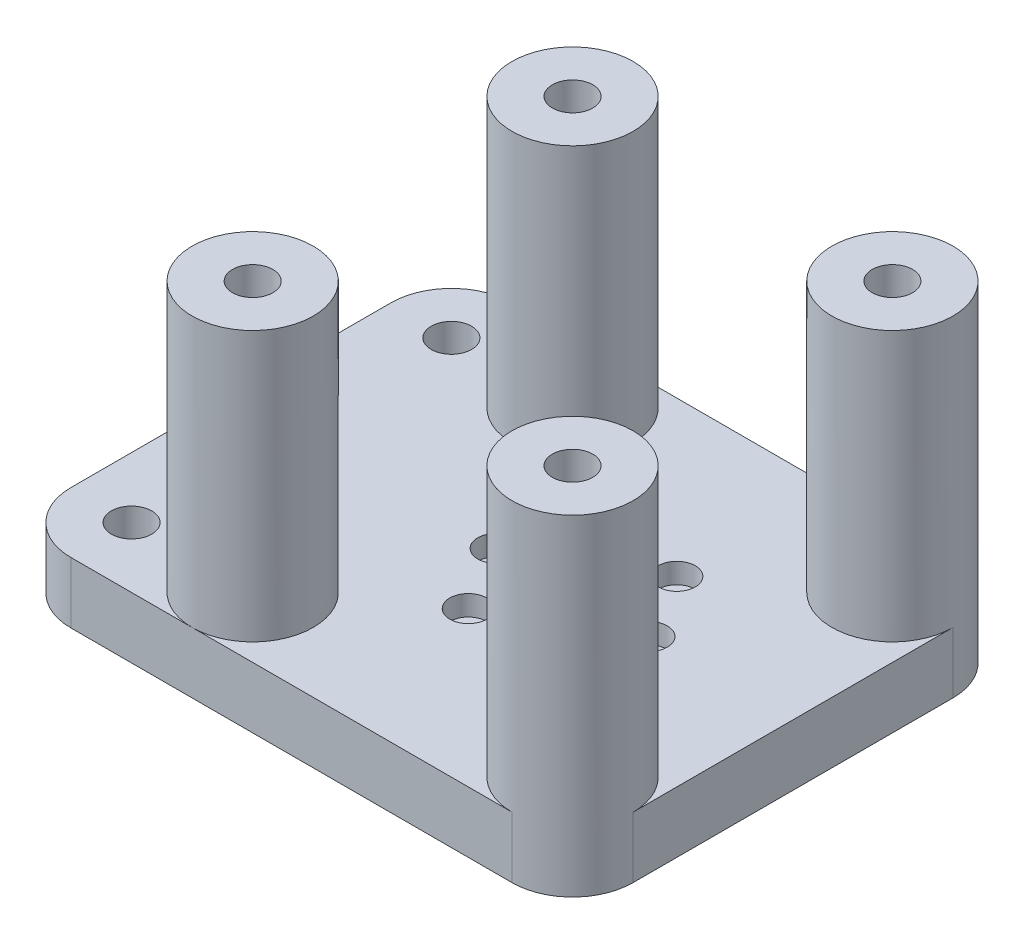
ISO-10303-21;
HEADER;
FILE_DESCRIPTION(('STEP AP214'),'2;1');
FILE_NAME('part.step','',(''),(''),'','','');
FILE_SCHEMA(('AUTOMOTIVE_DESIGN { 1 0 10303 214 1 1 1 1 }'));
ENDSEC;
DATA;
#1=APPLICATION_CONTEXT('core data for automotive mechanical design processes');
#2=APPLICATION_PROTOCOL_DEFINITION('international standard','automotive_design',2000,#1);
#3=PRODUCT_CONTEXT('',#1,'mechanical');
#4=PRODUCT('Part','Part','',(#3));
#5=PRODUCT_RELATED_PRODUCT_CATEGORY('part','',(#4));
#6=PRODUCT_DEFINITION_FORMATION('','',#4);
#7=PRODUCT_DEFINITION_CONTEXT('part definition',#1,'design');
#8=PRODUCT_DEFINITION('design','',#6,#7);
#9=PRODUCT_DEFINITION_SHAPE('','',#8);
#10=(LENGTH_UNIT() NAMED_UNIT(*) SI_UNIT(.MILLI.,.METRE.));
#11=(NAMED_UNIT(*) PLANE_ANGLE_UNIT() SI_UNIT($,.RADIAN.));
#12=(NAMED_UNIT(*) SI_UNIT($,.STERADIAN.) SOLID_ANGLE_UNIT());
#13=UNCERTAINTY_MEASURE_WITH_UNIT(LENGTH_MEASURE(1.E-05),#10,'distance_accuracy_value','');
#14=(GEOMETRIC_REPRESENTATION_CONTEXT(3) GLOBAL_UNCERTAINTY_ASSIGNED_CONTEXT((#13)) GLOBAL_UNIT_ASSIGNED_CONTEXT((#10,
#11,#12)) REPRESENTATION_CONTEXT('',''));
#15=CARTESIAN_POINT('',(0.,0.,0.));
#16=DIRECTION('',(0.,0.,1.));
#17=DIRECTION('',(1.,0.,0.));
#18=AXIS2_PLACEMENT_3D('',#15,#16,#17);
#19=CARTESIAN_POINT('',(31.430896423742,12.,-31.430896423742));
#20=DIRECTION('',(0.,1.,0.));
#21=DIRECTION('',(0.,0.,1.));
#22=AXIS2_PLACEMENT_3D('',#19,#20,#21);
#23=PLANE('',#22);
#24=CARTESIAN_POINT('',(-55.243396423742,12.,31.430896423742));
#25=DIRECTION('',(0.,1.,0.));
#26=DIRECTION('',(0.,0.,1.));
#27=AXIS2_PLACEMENT_3D('',#24,#25,#26);
#28=CIRCLE('',#27,3.96875);
#29=CARTESIAN_POINT('',(-55.243396423742,12.,35.399646423742));
#30=VERTEX_POINT('',#29);
#31=EDGE_CURVE('E221',#30,#30,#28,.T.);
#32=ORIENTED_EDGE('',*,*,#31,.F.);
#33=EDGE_LOOP('',(#32));
#34=FACE_BOUND('',#33,.T.);
#35=CARTESIAN_POINT('',(0.,12.,0.));
#36=DIRECTION('',(0.,1.,0.));
#37=DIRECTION('',(0.,0.,1.));
#38=AXIS2_PLACEMENT_3D('',#35,#36,#37);
#39=CIRCLE('',#38,10.5);
#40=CARTESIAN_POINT('',(0.,12.,10.5));
#41=VERTEX_POINT('',#40);
#42=EDGE_CURVE('E260',#41,#41,#39,.T.);
#43=ORIENTED_EDGE('',*,*,#42,.F.);
#44=EDGE_LOOP('',(#43));
#45=FACE_BOUND('',#44,.T.);
#46=CARTESIAN_POINT('',(-55.243396423742,12.,-31.430896423742));
#47=DIRECTION('',(0.,1.,0.));
#48=DIRECTION('',(0.,0.,1.));
#49=AXIS2_PLACEMENT_3D('',#46,#47,#48);
#50=CIRCLE('',#49,3.96875);
#51=CARTESIAN_POINT('',(-55.243396423742,12.,-27.462146423742));
#52=VERTEX_POINT('',#51);
#53=EDGE_CURVE('E227',#52,#52,#50,.T.);
#54=ORIENTED_EDGE('',*,*,#53,.F.);
#55=EDGE_LOOP('',(#54));
#56=FACE_BOUND('',#55,.T.);
#57=CARTESIAN_POINT('',(-7.5,12.,-12.9903810567666));
#58=DIRECTION('',(0.,1.,0.));
#59=DIRECTION('',(0.,0.,1.));
#60=AXIS2_PLACEMENT_3D('',#57,#58,#59);
#61=CIRCLE('',#60,3.62500000000001);
#62=CARTESIAN_POINT('',(-7.5,12.,-9.36538105676656));
#63=VERTEX_POINT('',#62);
#64=EDGE_CURVE('E177',#63,#63,#61,.T.);
#65=ORIENTED_EDGE('',*,*,#64,.F.);
#66=EDGE_LOOP('',(#65));
#67=FACE_BOUND('',#66,.T.);
#68=CARTESIAN_POINT('',(7.50000000000001,12.,-12.9903810567666));
#69=DIRECTION('',(0.,1.,0.));
#70=DIRECTION('',(0.,0.,1.));
#71=AXIS2_PLACEMENT_3D('',#68,#69,#70);
#72=CIRCLE('',#71,3.625);
#73=CARTESIAN_POINT('',(7.50000000000001,12.,-9.36538105676657));
#74=VERTEX_POINT('',#73);
#75=EDGE_CURVE('E182',#74,#74,#72,.T.);
#76=ORIENTED_EDGE('',*,*,#75,.F.);
#77=EDGE_LOOP('',(#76));
#78=FACE_BOUND('',#77,.T.);
#79=CARTESIAN_POINT('',(15.,12.,0.));
#80=DIRECTION('',(0.,1.,0.));
#81=DIRECTION('',(0.,0.,1.));
#82=AXIS2_PLACEMENT_3D('',#79,#80,#81);
#83=CIRCLE('',#82,3.625);
#84=CARTESIAN_POINT('',(15.,12.,3.62500000000003));
#85=VERTEX_POINT('',#84);
#86=EDGE_CURVE('E186',#85,#85,#83,.T.);
#87=ORIENTED_EDGE('',*,*,#86,.F.);
#88=EDGE_LOOP('',(#87));
#89=FACE_BOUND('',#88,.T.);
#90=CARTESIAN_POINT('',(7.49999999999998,12.,12.9903810567666));
#91=DIRECTION('',(0.,1.,0.));
#92=DIRECTION('',(0.,0.,1.));
#93=AXIS2_PLACEMENT_3D('',#90,#91,#92);
#94=CIRCLE('',#93,3.625);
#95=CARTESIAN_POINT('',(7.49999999999998,12.,16.6153810567666));
#96=VERTEX_POINT('',#95);
#97=EDGE_CURVE('E190',#96,#96,#94,.T.);
#98=ORIENTED_EDGE('',*,*,#97,.F.);
#99=EDGE_LOOP('',(#98));
#100=FACE_BOUND('',#99,.T.);
#101=CARTESIAN_POINT('',(-7.50000000000002,12.,12.9903810567666));
#102=DIRECTION('',(0.,1.,0.));
#103=DIRECTION('',(0.,0.,1.));
#104=AXIS2_PLACEMENT_3D('',#101,#102,#103);
#105=CIRCLE('',#104,3.62499999999999);
#106=CARTESIAN_POINT('',(-7.50000000000002,12.,16.6153810567666));
#107=VERTEX_POINT('',#106);
#108=EDGE_CURVE('E197',#107,#107,#105,.T.);
#109=ORIENTED_EDGE('',*,*,#108,.F.);
#110=EDGE_LOOP('',(#109));
#111=FACE_BOUND('',#110,.T.);
#112=CARTESIAN_POINT('',(-15.,12.,0.));
#113=DIRECTION('',(0.,1.,0.));
#114=DIRECTION('',(0.,0.,1.));
#115=AXIS2_PLACEMENT_3D('',#112,#113,#114);
#116=CIRCLE('',#115,3.625);
#117=CARTESIAN_POINT('',(-15.,12.,3.62500000000001));
#118=VERTEX_POINT('',#117);
#119=EDGE_CURVE('E204',#118,#118,#116,.T.);
#120=ORIENTED_EDGE('',*,*,#119,.F.);
#121=EDGE_LOOP('',(#120));
#122=FACE_BOUND('',#121,.T.);
#123=DIRECTION('',(1.,0.,0.));
#124=VECTOR('',#123,1.);
#125=CARTESIAN_POINT('',(-55.243396423742,12.,43.337146423742));
#126=LINE('',#125,#124);
#127=CARTESIAN_POINT('',(-55.243396423742,12.,43.337146423742));
#128=VERTEX_POINT('',#127);
#129=CARTESIAN_POINT('',(-31.430896423742,12.,43.337146423742));
#130=VERTEX_POINT('',#129);
#131=EDGE_CURVE('E116',#128,#130,#126,.T.);
#132=ORIENTED_EDGE('',*,*,#131,.T.);
#133=CARTESIAN_POINT('',(-31.430896423742,12.,31.430896423742));
#134=DIRECTION('',(0.,1.,0.));
#135=DIRECTION('',(0.,0.,1.));
#136=AXIS2_PLACEMENT_3D('',#133,#134,#135);
#137=CIRCLE('',#136,11.90625);
#138=EDGE_CURVE('E52',#130,#130,#137,.T.);
#139=ORIENTED_EDGE('',*,*,#138,.F.);
#140=CARTESIAN_POINT('',(31.430896423742,12.,43.337146423742));
#141=VERTEX_POINT('',#140);
#142=EDGE_CURVE('E122',#130,#141,#126,.T.);
#143=ORIENTED_EDGE('',*,*,#142,.T.);
#144=CARTESIAN_POINT('',(31.430896423742,12.,31.430896423742));
#145=DIRECTION('',(0.,1.,0.));
#146=DIRECTION('',(0.,0.,1.));
#147=AXIS2_PLACEMENT_3D('',#144,#145,#146);
#148=CIRCLE('',#147,11.90625);
#149=CARTESIAN_POINT('',(43.337146423742,12.,31.430896423742));
#150=VERTEX_POINT('',#149);
#151=EDGE_CURVE('E289',#150,#141,#148,.T.);
#152=ORIENTED_EDGE('',*,*,#151,.F.);
#153=DIRECTION('',(0.,0.,-1.));
#154=VECTOR('',#153,1.);
#155=CARTESIAN_POINT('',(43.337146423742,12.,-31.430896423742));
#156=LINE('',#155,#154);
#157=CARTESIAN_POINT('',(43.337146423742,12.,-31.430896423742));
#158=VERTEX_POINT('',#157);
#159=EDGE_CURVE('E60',#150,#158,#156,.T.);
#160=ORIENTED_EDGE('',*,*,#159,.T.);
#161=CARTESIAN_POINT('',(31.430896423742,12.,-31.4308964237421));
#162=DIRECTION('',(0.,1.,0.));
#163=DIRECTION('',(0.,0.,1.));
#164=AXIS2_PLACEMENT_3D('',#161,#162,#163);
#165=CIRCLE('',#164,11.90625);
#166=CARTESIAN_POINT('',(31.430896423742,12.,-43.337146423742));
#167=VERTEX_POINT('',#166);
#168=EDGE_CURVE('E303',#167,#158,#165,.T.);
#169=ORIENTED_EDGE('',*,*,#168,.F.);
#170=DIRECTION('',(-1.,0.,0.));
#171=VECTOR('',#170,1.);
#172=CARTESIAN_POINT('',(-55.243396423742,12.,-43.337146423742));
#173=LINE('',#172,#171);
#174=CARTESIAN_POINT('',(-31.430896423742,12.,-43.337146423742));
#175=VERTEX_POINT('',#174);
#176=EDGE_CURVE('E267',#167,#175,#173,.T.);
#177=ORIENTED_EDGE('',*,*,#176,.T.);
#178=CARTESIAN_POINT('',(-31.430896423742,12.,-31.430896423742));
#179=DIRECTION('',(0.,1.,0.));
#180=DIRECTION('',(0.,0.,1.));
#181=AXIS2_PLACEMENT_3D('',#178,#179,#180);
#182=CIRCLE('',#181,11.90625);
#183=EDGE_CURVE('E312',#175,#175,#182,.T.);
#184=ORIENTED_EDGE('',*,*,#183,.F.);
#185=CARTESIAN_POINT('',(-55.243396423742,12.,-43.337146423742));
#186=VERTEX_POINT('',#185);
#187=EDGE_CURVE('E102',#175,#186,#173,.T.);
#188=ORIENTED_EDGE('',*,*,#187,.T.);
#189=CARTESIAN_POINT('',(-55.243396423742,12.,-31.430896423742));
#190=DIRECTION('',(0.,1.,0.));
#191=DIRECTION('',(0.,0.,1.));
#192=AXIS2_PLACEMENT_3D('',#189,#190,#191);
#193=CIRCLE('',#192,11.90625);
#194=CARTESIAN_POINT('',(-67.149646423742,12.,-31.430896423742));
#195=VERTEX_POINT('',#194);
#196=EDGE_CURVE('E270',#186,#195,#193,.T.);
#197=ORIENTED_EDGE('',*,*,#196,.T.);
#198=DIRECTION('',(0.,0.,1.));
#199=VECTOR('',#198,1.);
#200=CARTESIAN_POINT('',(-67.149646423742,12.,-31.430896423742));
#201=LINE('',#200,#199);
#202=CARTESIAN_POINT('',(-67.149646423742,12.,31.430896423742));
#203=VERTEX_POINT('',#202);
#204=EDGE_CURVE('E118',#195,#203,#201,.T.);
#205=ORIENTED_EDGE('',*,*,#204,.T.);
#206=CARTESIAN_POINT('',(-55.243396423742,12.,31.430896423742));
#207=DIRECTION('',(0.,1.,0.));
#208=DIRECTION('',(0.,0.,1.));
#209=AXIS2_PLACEMENT_3D('',#206,#207,#208);
#210=CIRCLE('',#209,11.90625);
#211=EDGE_CURVE('E113',#203,#128,#210,.T.);
#212=ORIENTED_EDGE('',*,*,#211,.T.);
#213=EDGE_LOOP('',(#132,#139,#143,#152,#160,#169,#177,#184,#188,#197,#205,#212));
#214=FACE_BOUND('',#213,.T.);
#215=ADVANCED_FACE('F37',(#34,#45,#56,#67,#78,#89,#100,#111,#122,#214),#23,.T.);
#216=CARTESIAN_POINT('',(-15.,12.,0.));
#217=DIRECTION('',(0.,-1.,0.));
#218=DIRECTION('',(0.,0.,-1.));
#219=AXIS2_PLACEMENT_3D('',#216,#217,#218);
#220=CYLINDRICAL_SURFACE('',#219,2.);
#221=CARTESIAN_POINT('',(-15.,0.,0.));
#222=DIRECTION('',(0.,1.,0.));
#223=DIRECTION('',(0.,0.,1.));
#224=AXIS2_PLACEMENT_3D('',#221,#222,#223);
#225=CIRCLE('',#224,2.);
#226=CARTESIAN_POINT('',(-15.,0.,2.00000000000001));
#227=VERTEX_POINT('',#226);
#228=EDGE_CURVE('E230',#227,#227,#225,.T.);
#229=ORIENTED_EDGE('',*,*,#228,.F.);
#230=EDGE_LOOP('',(#229));
#231=FACE_BOUND('',#230,.T.);
#232=CARTESIAN_POINT('',(-15.,8.,0.));
#233=DIRECTION('',(0.,1.,0.));
#234=DIRECTION('',(0.,0.,1.));
#235=AXIS2_PLACEMENT_3D('',#232,#233,#234);
#236=CIRCLE('',#235,2.);
#237=CARTESIAN_POINT('',(-15.,8.,2.00000000000001));
#238=VERTEX_POINT('',#237);
#239=EDGE_CURVE('E41',#238,#238,#236,.T.);
#240=ORIENTED_EDGE('',*,*,#239,.T.);
#241=EDGE_LOOP('',(#240));
#242=FACE_BOUND('',#241,.T.);
#243=ADVANCED_FACE('F330',(#231,#242),#220,.F.);
#244=CARTESIAN_POINT('',(-7.49999999999999,12.,12.9903810567666));
#245=DIRECTION('',(0.,-1.,0.));
#246=DIRECTION('',(0.,0.,-1.));
#247=AXIS2_PLACEMENT_3D('',#244,#245,#246);
#248=CYLINDRICAL_SURFACE('',#247,2.);
#249=CARTESIAN_POINT('',(-7.49999999999999,0.,12.9903810567666));
#250=DIRECTION('',(0.,1.,0.));
#251=DIRECTION('',(0.,0.,1.));
#252=AXIS2_PLACEMENT_3D('',#249,#250,#251);
#253=CIRCLE('',#252,2.);
#254=CARTESIAN_POINT('',(-7.49999999999999,0.,14.9903810567666));
#255=VERTEX_POINT('',#254);
#256=EDGE_CURVE('E235',#255,#255,#253,.T.);
#257=ORIENTED_EDGE('',*,*,#256,.F.);
#258=EDGE_LOOP('',(#257));
#259=FACE_BOUND('',#258,.T.);
#260=CARTESIAN_POINT('',(-7.49999999999999,8.,12.9903810567666));
#261=DIRECTION('',(0.,1.,0.));
#262=DIRECTION('',(0.,0.,1.));
#263=AXIS2_PLACEMENT_3D('',#260,#261,#262);
#264=CIRCLE('',#263,2.);
#265=CARTESIAN_POINT('',(-7.49999999999999,8.,14.9903810567666));
#266=VERTEX_POINT('',#265);
#267=EDGE_CURVE('E188',#266,#266,#264,.T.);
#268=ORIENTED_EDGE('',*,*,#267,.T.);
#269=EDGE_LOOP('',(#268));
#270=FACE_BOUND('',#269,.T.);
#271=ADVANCED_FACE('F336',(#259,#270),#248,.F.);
#272=CARTESIAN_POINT('',(7.5,12.,12.9903810567666));
#273=DIRECTION('',(0.,-1.,0.));
#274=DIRECTION('',(0.,0.,-1.));
#275=AXIS2_PLACEMENT_3D('',#272,#273,#274);
#276=CYLINDRICAL_SURFACE('',#275,2.);
#277=CARTESIAN_POINT('',(7.5,0.,12.9903810567666));
#278=DIRECTION('',(0.,1.,0.));
#279=DIRECTION('',(0.,0.,1.));
#280=AXIS2_PLACEMENT_3D('',#277,#278,#279);
#281=CIRCLE('',#280,2.);
#282=CARTESIAN_POINT('',(7.5,0.,14.9903810567666));
#283=VERTEX_POINT('',#282);
#284=EDGE_CURVE('E238',#283,#283,#281,.T.);
#285=ORIENTED_EDGE('',*,*,#284,.F.);
#286=EDGE_LOOP('',(#285));
#287=FACE_BOUND('',#286,.T.);
#288=CARTESIAN_POINT('',(7.5,8.,12.9903810567666));
#289=DIRECTION('',(0.,1.,0.));
#290=DIRECTION('',(0.,0.,1.));
#291=AXIS2_PLACEMENT_3D('',#288,#289,#290);
#292=CIRCLE('',#291,2.);
#293=CARTESIAN_POINT('',(7.5,8.,14.9903810567666));
#294=VERTEX_POINT('',#293);
#295=EDGE_CURVE('E184',#294,#294,#292,.T.);
#296=ORIENTED_EDGE('',*,*,#295,.T.);
#297=EDGE_LOOP('',(#296));
#298=FACE_BOUND('',#297,.T.);
#299=ADVANCED_FACE('F445',(#287,#298),#276,.F.);
#300=CARTESIAN_POINT('',(15.,12.,0.));
#301=DIRECTION('',(0.,-1.,0.));
#302=DIRECTION('',(0.,0.,-1.));
#303=AXIS2_PLACEMENT_3D('',#300,#301,#302);
#304=CYLINDRICAL_SURFACE('',#303,2.);
#305=CARTESIAN_POINT('',(15.,0.,0.));
#306=DIRECTION('',(0.,1.,0.));
#307=DIRECTION('',(0.,0.,1.));
#308=AXIS2_PLACEMENT_3D('',#305,#306,#307);
#309=CIRCLE('',#308,2.);
#310=CARTESIAN_POINT('',(15.,0.,2.));
#311=VERTEX_POINT('',#310);
#312=EDGE_CURVE('E241',#311,#311,#309,.T.);
#313=ORIENTED_EDGE('',*,*,#312,.F.);
#314=EDGE_LOOP('',(#313));
#315=FACE_BOUND('',#314,.T.);
#316=CARTESIAN_POINT('',(15.,8.,0.));
#317=DIRECTION('',(0.,1.,0.));
#318=DIRECTION('',(0.,0.,1.));
#319=AXIS2_PLACEMENT_3D('',#316,#317,#318);
#320=CIRCLE('',#319,2.);
#321=CARTESIAN_POINT('',(15.,8.,2.));
#322=VERTEX_POINT('',#321);
#323=EDGE_CURVE('E179',#322,#322,#320,.T.);
#324=ORIENTED_EDGE('',*,*,#323,.T.);
#325=EDGE_LOOP('',(#324));
#326=FACE_BOUND('',#325,.T.);
#327=ADVANCED_FACE('F449',(#315,#326),#304,.F.);
#328=CARTESIAN_POINT('',(7.5,12.,-12.9903810567666));
#329=DIRECTION('',(0.,-1.,0.));
#330=DIRECTION('',(0.,0.,-1.));
#331=AXIS2_PLACEMENT_3D('',#328,#329,#330);
#332=CYLINDRICAL_SURFACE('',#331,2.);
#333=CARTESIAN_POINT('',(7.5,0.,-12.9903810567666));
#334=DIRECTION('',(0.,1.,0.));
#335=DIRECTION('',(0.,0.,1.));
#336=AXIS2_PLACEMENT_3D('',#333,#334,#335);
#337=CIRCLE('',#336,2.);
#338=CARTESIAN_POINT('',(7.5,0.,-10.9903810567666));
#339=VERTEX_POINT('',#338);
#340=EDGE_CURVE('E244',#339,#339,#337,.T.);
#341=ORIENTED_EDGE('',*,*,#340,.F.);
#342=EDGE_LOOP('',(#341));
#343=FACE_BOUND('',#342,.T.);
#344=CARTESIAN_POINT('',(7.5,8.,-12.9903810567666));
#345=DIRECTION('',(0.,1.,0.));
#346=DIRECTION('',(0.,0.,1.));
#347=AXIS2_PLACEMENT_3D('',#344,#345,#346);
#348=CIRCLE('',#347,2.);
#349=CARTESIAN_POINT('',(7.5,8.,-10.9903810567666));
#350=VERTEX_POINT('',#349);
#351=EDGE_CURVE('E174',#350,#350,#348,.T.);
#352=ORIENTED_EDGE('',*,*,#351,.T.);
#353=EDGE_LOOP('',(#352));
#354=FACE_BOUND('',#353,.T.);
#355=ADVANCED_FACE('F453',(#343,#354),#332,.F.);
#356=CARTESIAN_POINT('',(-7.5,12.,-12.9903810567666));
#357=DIRECTION('',(0.,-1.,0.));
#358=DIRECTION('',(0.,0.,-1.));
#359=AXIS2_PLACEMENT_3D('',#356,#357,#358);
#360=CYLINDRICAL_SURFACE('',#359,2.);
#361=CARTESIAN_POINT('',(-7.5,0.,-12.9903810567666));
#362=DIRECTION('',(0.,1.,0.));
#363=DIRECTION('',(0.,0.,1.));
#364=AXIS2_PLACEMENT_3D('',#361,#362,#363);
#365=CIRCLE('',#364,2.);
#366=CARTESIAN_POINT('',(-7.5,0.,-10.9903810567666));
#367=VERTEX_POINT('',#366);
#368=EDGE_CURVE('E247',#367,#367,#365,.T.);
#369=ORIENTED_EDGE('',*,*,#368,.F.);
#370=EDGE_LOOP('',(#369));
#371=FACE_BOUND('',#370,.T.);
#372=CARTESIAN_POINT('',(-7.5,8.,-12.9903810567666));
#373=DIRECTION('',(0.,1.,0.));
#374=DIRECTION('',(0.,0.,1.));
#375=AXIS2_PLACEMENT_3D('',#372,#373,#374);
#376=CIRCLE('',#375,2.);
#377=CARTESIAN_POINT('',(-7.5,8.,-10.9903810567666));
#378=VERTEX_POINT('',#377);
#379=EDGE_CURVE('E169',#378,#378,#376,.T.);
#380=ORIENTED_EDGE('',*,*,#379,.T.);
#381=EDGE_LOOP('',(#380));
#382=FACE_BOUND('',#381,.T.);
#383=ADVANCED_FACE('F347',(#371,#382),#360,.F.);
#384=CARTESIAN_POINT('',(31.430896423742,0.,-31.430896423742));
#385=DIRECTION('',(0.,1.,0.));
#386=DIRECTION('',(0.,0.,1.));
#387=AXIS2_PLACEMENT_3D('',#384,#385,#386);
#388=PLANE('',#387);
#389=CARTESIAN_POINT('',(31.430896423742,0.,-31.430896423742));
#390=DIRECTION('',(0.,1.,0.));
#391=DIRECTION('',(0.,0.,1.));
#392=AXIS2_PLACEMENT_3D('',#389,#390,#391);
#393=CIRCLE('',#392,11.90625);
#394=CARTESIAN_POINT('',(43.337146423742,0.,-31.430896423742));
#395=VERTEX_POINT('',#394);
#396=CARTESIAN_POINT('',(31.430896423742,0.,-43.337146423742));
#397=VERTEX_POINT('',#396);
#398=EDGE_CURVE('E142',#395,#397,#393,.T.);
#399=ORIENTED_EDGE('',*,*,#398,.F.);
#400=DIRECTION('',(0.,0.,-1.));
#401=VECTOR('',#400,1.);
#402=CARTESIAN_POINT('',(43.337146423742,0.,-31.430896423742));
#403=LINE('',#402,#401);
#404=CARTESIAN_POINT('',(43.337146423742,0.,31.430896423742));
#405=VERTEX_POINT('',#404);
#406=EDGE_CURVE('E94',#405,#395,#403,.T.);
#407=ORIENTED_EDGE('',*,*,#406,.F.);
#408=CARTESIAN_POINT('',(31.430896423742,0.,31.430896423742));
#409=DIRECTION('',(0.,1.,0.));
#410=DIRECTION('',(0.,0.,1.));
#411=AXIS2_PLACEMENT_3D('',#408,#409,#410);
#412=CIRCLE('',#411,11.90625);
#413=CARTESIAN_POINT('',(31.430896423742,0.,43.337146423742));
#414=VERTEX_POINT('',#413);
#415=EDGE_CURVE('E155',#414,#405,#412,.T.);
#416=ORIENTED_EDGE('',*,*,#415,.F.);
#417=DIRECTION('',(1.,0.,0.));
#418=VECTOR('',#417,1.);
#419=CARTESIAN_POINT('',(-55.243396423742,0.,43.337146423742));
#420=LINE('',#419,#418);
#421=CARTESIAN_POINT('',(-55.243396423742,0.,43.337146423742));
#422=VERTEX_POINT('',#421);
#423=EDGE_CURVE('E153',#422,#414,#420,.T.);
#424=ORIENTED_EDGE('',*,*,#423,.F.);
#425=CARTESIAN_POINT('',(-55.243396423742,0.,31.430896423742));
#426=DIRECTION('',(0.,1.,0.));
#427=DIRECTION('',(0.,0.,1.));
#428=AXIS2_PLACEMENT_3D('',#425,#426,#427);
#429=CIRCLE('',#428,11.90625);
#430=CARTESIAN_POINT('',(-67.149646423742,0.,31.430896423742));
#431=VERTEX_POINT('',#430);
#432=EDGE_CURVE('E128',#431,#422,#429,.T.);
#433=ORIENTED_EDGE('',*,*,#432,.F.);
#434=DIRECTION('',(0.,0.,1.));
#435=VECTOR('',#434,1.);
#436=CARTESIAN_POINT('',(-67.149646423742,0.,-31.430896423742));
#437=LINE('',#436,#435);
#438=CARTESIAN_POINT('',(-67.149646423742,0.,-31.430896423742));
#439=VERTEX_POINT('',#438);
#440=EDGE_CURVE('E150',#439,#431,#437,.T.);
#441=ORIENTED_EDGE('',*,*,#440,.F.);
#442=CARTESIAN_POINT('',(-55.243396423742,0.,-31.430896423742));
#443=DIRECTION('',(0.,1.,0.));
#444=DIRECTION('',(0.,0.,1.));
#445=AXIS2_PLACEMENT_3D('',#442,#443,#444);
#446=CIRCLE('',#445,11.90625);
#447=CARTESIAN_POINT('',(-55.243396423742,0.,-43.337146423742));
#448=VERTEX_POINT('',#447);
#449=EDGE_CURVE('E148',#448,#439,#446,.T.);
#450=ORIENTED_EDGE('',*,*,#449,.F.);
#451=DIRECTION('',(-1.,0.,0.));
#452=VECTOR('',#451,1.);
#453=CARTESIAN_POINT('',(-55.243396423742,0.,-43.337146423742));
#454=LINE('',#453,#452);
#455=EDGE_CURVE('E145',#397,#448,#454,.T.);
#456=ORIENTED_EDGE('',*,*,#455,.F.);
#457=EDGE_LOOP('',(#399,#407,#416,#424,#433,#441,#450,#456));
#458=FACE_BOUND('',#457,.T.);
#459=CARTESIAN_POINT('',(-31.430896423742,0.,-31.430896423742));
#460=DIRECTION('',(0.,1.,0.));
#461=DIRECTION('',(0.,0.,1.));
#462=AXIS2_PLACEMENT_3D('',#459,#460,#461);
#463=CIRCLE('',#462,3.96875);
#464=CARTESIAN_POINT('',(-31.430896423742,0.,-27.462146423742));
#465=VERTEX_POINT('',#464);
#466=EDGE_CURVE('E146',#465,#465,#463,.T.);
#467=ORIENTED_EDGE('',*,*,#466,.T.);
#468=EDGE_LOOP('',(#467));
#469=FACE_BOUND('',#468,.T.);
#470=CARTESIAN_POINT('',(0.,0.,0.));
#471=DIRECTION('',(0.,1.,0.));
#472=DIRECTION('',(0.,0.,1.));
#473=AXIS2_PLACEMENT_3D('',#470,#471,#472);
#474=CIRCLE('',#473,10.5);
#475=CARTESIAN_POINT('',(0.,0.,10.5));
#476=VERTEX_POINT('',#475);
#477=EDGE_CURVE('E259',#476,#476,#474,.T.);
#478=ORIENTED_EDGE('',*,*,#477,.T.);
#479=EDGE_LOOP('',(#478));
#480=FACE_BOUND('',#479,.T.);
#481=CARTESIAN_POINT('',(31.430896423742,0.,-31.430896423742));
#482=DIRECTION('',(0.,1.,0.));
#483=DIRECTION('',(0.,0.,1.));
#484=AXIS2_PLACEMENT_3D('',#481,#482,#483);
#485=CIRCLE('',#484,3.96875);
#486=CARTESIAN_POINT('',(31.430896423742,0.,-27.462146423742));
#487=VERTEX_POINT('',#486);
#488=EDGE_CURVE('E256',#487,#487,#485,.T.);
#489=ORIENTED_EDGE('',*,*,#488,.T.);
#490=EDGE_LOOP('',(#489));
#491=FACE_BOUND('',#490,.T.);
#492=CARTESIAN_POINT('',(31.430896423742,0.,31.430896423742));
#493=DIRECTION('',(0.,1.,0.));
#494=DIRECTION('',(0.,0.,1.));
#495=AXIS2_PLACEMENT_3D('',#492,#493,#494);
#496=CIRCLE('',#495,3.96875);
#497=CARTESIAN_POINT('',(31.430896423742,0.,35.399646423742));
#498=VERTEX_POINT('',#497);
#499=EDGE_CURVE('E253',#498,#498,#496,.T.);
#500=ORIENTED_EDGE('',*,*,#499,.T.);
#501=EDGE_LOOP('',(#500));
#502=FACE_BOUND('',#501,.T.);
#503=CARTESIAN_POINT('',(-31.430896423742,0.,31.430896423742));
#504=DIRECTION('',(0.,1.,0.));
#505=DIRECTION('',(0.,0.,1.));
#506=AXIS2_PLACEMENT_3D('',#503,#504,#505);
#507=CIRCLE('',#506,3.96875);
#508=CARTESIAN_POINT('',(-31.430896423742,0.,35.399646423742));
#509=VERTEX_POINT('',#508);
#510=EDGE_CURVE('E250',#509,#509,#507,.T.);
#511=ORIENTED_EDGE('',*,*,#510,.T.);
#512=EDGE_LOOP('',(#511));
#513=FACE_BOUND('',#512,.T.);
#514=ORIENTED_EDGE('',*,*,#368,.T.);
#515=EDGE_LOOP('',(#514));
#516=FACE_BOUND('',#515,.T.);
#517=ORIENTED_EDGE('',*,*,#340,.T.);
#518=EDGE_LOOP('',(#517));
#519=FACE_BOUND('',#518,.T.);
#520=ORIENTED_EDGE('',*,*,#312,.T.);
#521=EDGE_LOOP('',(#520));
#522=FACE_BOUND('',#521,.T.);
#523=ORIENTED_EDGE('',*,*,#284,.T.);
#524=EDGE_LOOP('',(#523));
#525=FACE_BOUND('',#524,.T.);
#526=ORIENTED_EDGE('',*,*,#256,.T.);
#527=EDGE_LOOP('',(#526));
#528=FACE_BOUND('',#527,.T.);
#529=ORIENTED_EDGE('',*,*,#228,.T.);
#530=EDGE_LOOP('',(#529));
#531=FACE_BOUND('',#530,.T.);
#532=CARTESIAN_POINT('',(-55.243396423742,0.,-31.430896423742));
#533=DIRECTION('',(0.,1.,0.));
#534=DIRECTION('',(0.,0.,1.));
#535=AXIS2_PLACEMENT_3D('',#532,#533,#534);
#536=CIRCLE('',#535,3.96875);
#537=CARTESIAN_POINT('',(-55.243396423742,0.,-27.462146423742));
#538=VERTEX_POINT('',#537);
#539=EDGE_CURVE('E224',#538,#538,#536,.T.);
#540=ORIENTED_EDGE('',*,*,#539,.T.);
#541=EDGE_LOOP('',(#540));
#542=FACE_BOUND('',#541,.T.);
#543=CARTESIAN_POINT('',(-55.243396423742,0.,31.430896423742));
#544=DIRECTION('',(0.,1.,0.));
#545=DIRECTION('',(0.,0.,1.));
#546=AXIS2_PLACEMENT_3D('',#543,#544,#545);
#547=CIRCLE('',#546,3.96875);
#548=CARTESIAN_POINT('',(-55.243396423742,0.,35.399646423742));
#549=VERTEX_POINT('',#548);
#550=EDGE_CURVE('E172',#549,#549,#547,.T.);
#551=ORIENTED_EDGE('',*,*,#550,.T.);
#552=EDGE_LOOP('',(#551));
#553=FACE_BOUND('',#552,.T.);
#554=ADVANCED_FACE('F281',(#458,#469,#480,#491,#502,#513,#516,#519,#522,#525,#528,#531,#542,
#553),#388,.F.);
#555=CARTESIAN_POINT('',(31.430896423742,12.,-31.430896423742));
#556=DIRECTION('',(0.,-1.,0.));
#557=DIRECTION('',(0.,0.,-1.));
#558=AXIS2_PLACEMENT_3D('',#555,#556,#557);
#559=CYLINDRICAL_SURFACE('',#558,11.90625);
#560=ORIENTED_EDGE('',*,*,#398,.T.);
#561=DIRECTION('',(0.,-1.,0.));
#562=VECTOR('',#561,1.);
#563=CARTESIAN_POINT('',(31.430896423742,12.,-43.337146423742));
#564=LINE('',#563,#562);
#565=EDGE_CURVE('E11',#167,#397,#564,.T.);
#566=ORIENTED_EDGE('',*,*,#565,.F.);
#567=ORIENTED_EDGE('',*,*,#168,.T.);
#568=DIRECTION('',(0.,-1.,0.));
#569=VECTOR('',#568,1.);
#570=CARTESIAN_POINT('',(43.337146423742,12.,-31.430896423742));
#571=LINE('',#570,#569);
#572=EDGE_CURVE('E138',#158,#395,#571,.T.);
#573=ORIENTED_EDGE('',*,*,#572,.T.);
#574=EDGE_LOOP('',(#560,#566,#567,#573));
#575=FACE_BOUND('',#574,.T.);
#576=CARTESIAN_POINT('',(31.430896423742,65.,-31.4308964237421));
#577=DIRECTION('',(0.,-1.,0.));
#578=DIRECTION('',(0.,0.,-1.));
#579=AXIS2_PLACEMENT_3D('',#576,#577,#578);
#580=CIRCLE('',#579,11.90625);
#581=CARTESIAN_POINT('',(31.430896423742,65.,-43.3371464237421));
#582=VERTEX_POINT('',#581);
#583=EDGE_CURVE('E295',#582,#582,#580,.T.);
#584=ORIENTED_EDGE('',*,*,#583,.T.);
#585=EDGE_LOOP('',(#584));
#586=FACE_BOUND('',#585,.T.);
#587=ADVANCED_FACE('F39',(#575,#586),#559,.T.);
#588=CARTESIAN_POINT('',(-55.243396423742,12.,-43.337146423742));
#589=DIRECTION('',(0.,0.,1.));
#590=DIRECTION('',(1.,0.,0.));
#591=AXIS2_PLACEMENT_3D('',#588,#589,#590);
#592=PLANE('',#591);
#593=ORIENTED_EDGE('',*,*,#455,.T.);
#594=DIRECTION('',(0.,-1.,0.));
#595=VECTOR('',#594,1.);
#596=CARTESIAN_POINT('',(-55.243396423742,12.,-43.337146423742));
#597=LINE('',#596,#595);
#598=EDGE_CURVE('E46',#186,#448,#597,.T.);
#599=ORIENTED_EDGE('',*,*,#598,.F.);
#600=ORIENTED_EDGE('',*,*,#187,.F.);
#601=ORIENTED_EDGE('',*,*,#176,.F.);
#602=ORIENTED_EDGE('',*,*,#565,.T.);
#603=EDGE_LOOP('',(#593,#599,#600,#601,#602));
#604=FACE_BOUND('',#603,.T.);
#605=ADVANCED_FACE('F360',(#604),#592,.F.);
#606=CARTESIAN_POINT('',(-55.243396423742,12.,-31.430896423742));
#607=DIRECTION('',(0.,-1.,0.));
#608=DIRECTION('',(0.,0.,-1.));
#609=AXIS2_PLACEMENT_3D('',#606,#607,#608);
#610=CYLINDRICAL_SURFACE('',#609,11.90625);
#611=ORIENTED_EDGE('',*,*,#449,.T.);
#612=DIRECTION('',(0.,-1.,0.));
#613=VECTOR('',#612,1.);
#614=CARTESIAN_POINT('',(-67.149646423742,12.,-31.430896423742));
#615=LINE('',#614,#613);
#616=EDGE_CURVE('E164',#195,#439,#615,.T.);
#617=ORIENTED_EDGE('',*,*,#616,.F.);
#618=ORIENTED_EDGE('',*,*,#196,.F.);
#619=ORIENTED_EDGE('',*,*,#598,.T.);
#620=EDGE_LOOP('',(#611,#617,#618,#619));
#621=FACE_BOUND('',#620,.T.);
#622=ADVANCED_FACE('F274',(#621),#610,.T.);
#623=CARTESIAN_POINT('',(-67.149646423742,12.,-31.430896423742));
#624=DIRECTION('',(1.,0.,0.));
#625=DIRECTION('',(0.,0.,-1.));
#626=AXIS2_PLACEMENT_3D('',#623,#624,#625);
#627=PLANE('',#626);
#628=ORIENTED_EDGE('',*,*,#440,.T.);
#629=DIRECTION('',(0.,-1.,0.));
#630=VECTOR('',#629,1.);
#631=CARTESIAN_POINT('',(-67.149646423742,12.,31.430896423742));
#632=LINE('',#631,#630);
#633=EDGE_CURVE('E131',#203,#431,#632,.T.);
#634=ORIENTED_EDGE('',*,*,#633,.F.);
#635=ORIENTED_EDGE('',*,*,#204,.F.);
#636=ORIENTED_EDGE('',*,*,#616,.T.);
#637=EDGE_LOOP('',(#628,#634,#635,#636));
#638=FACE_BOUND('',#637,.T.);
#639=ADVANCED_FACE('F278',(#638),#627,.F.);
#640=CARTESIAN_POINT('',(-55.243396423742,12.,31.430896423742));
#641=DIRECTION('',(0.,-1.,0.));
#642=DIRECTION('',(0.,0.,-1.));
#643=AXIS2_PLACEMENT_3D('',#640,#641,#642);
#644=CYLINDRICAL_SURFACE('',#643,11.90625);
#645=ORIENTED_EDGE('',*,*,#432,.T.);
#646=DIRECTION('',(0.,-1.,0.));
#647=VECTOR('',#646,1.);
#648=CARTESIAN_POINT('',(-55.243396423742,12.,43.337146423742));
#649=LINE('',#648,#647);
#650=EDGE_CURVE('E125',#128,#422,#649,.T.);
#651=ORIENTED_EDGE('',*,*,#650,.F.);
#652=ORIENTED_EDGE('',*,*,#211,.F.);
#653=ORIENTED_EDGE('',*,*,#633,.T.);
#654=EDGE_LOOP('',(#645,#651,#652,#653));
#655=FACE_BOUND('',#654,.T.);
#656=ADVANCED_FACE('F126',(#655),#644,.T.);
#657=CARTESIAN_POINT('',(-55.243396423742,12.,43.337146423742));
#658=DIRECTION('',(0.,0.,-1.));
#659=DIRECTION('',(-1.,0.,0.));
#660=AXIS2_PLACEMENT_3D('',#657,#658,#659);
#661=PLANE('',#660);
#662=ORIENTED_EDGE('',*,*,#423,.T.);
#663=DIRECTION('',(0.,-1.,0.));
#664=VECTOR('',#663,1.);
#665=CARTESIAN_POINT('',(31.430896423742,12.,43.337146423742));
#666=LINE('',#665,#664);
#667=EDGE_CURVE('E132',#141,#414,#666,.T.);
#668=ORIENTED_EDGE('',*,*,#667,.F.);
#669=ORIENTED_EDGE('',*,*,#142,.F.);
#670=ORIENTED_EDGE('',*,*,#131,.F.);
#671=ORIENTED_EDGE('',*,*,#650,.T.);
#672=EDGE_LOOP('',(#662,#668,#669,#670,#671));
#673=FACE_BOUND('',#672,.T.);
#674=ADVANCED_FACE('F135',(#673),#661,.F.);
#675=CARTESIAN_POINT('',(31.430896423742,12.,31.430896423742));
#676=DIRECTION('',(0.,-1.,0.));
#677=DIRECTION('',(0.,0.,-1.));
#678=AXIS2_PLACEMENT_3D('',#675,#676,#677);
#679=CYLINDRICAL_SURFACE('',#678,11.90625);
#680=ORIENTED_EDGE('',*,*,#415,.T.);
#681=DIRECTION('',(0.,-1.,0.));
#682=VECTOR('',#681,1.);
#683=CARTESIAN_POINT('',(43.337146423742,12.,31.430896423742));
#684=LINE('',#683,#682);
#685=EDGE_CURVE('E159',#150,#405,#684,.T.);
#686=ORIENTED_EDGE('',*,*,#685,.F.);
#687=ORIENTED_EDGE('',*,*,#151,.T.);
#688=ORIENTED_EDGE('',*,*,#667,.T.);
#689=EDGE_LOOP('',(#680,#686,#687,#688));
#690=FACE_BOUND('',#689,.T.);
#691=CARTESIAN_POINT('',(31.430896423742,65.,31.430896423742));
#692=DIRECTION('',(0.,-1.,0.));
#693=DIRECTION('',(0.,0.,-1.));
#694=AXIS2_PLACEMENT_3D('',#691,#692,#693);
#695=CIRCLE('',#694,11.90625);
#696=CARTESIAN_POINT('',(31.430896423742,65.,19.524646423742));
#697=VERTEX_POINT('',#696);
#698=EDGE_CURVE('E292',#697,#697,#695,.T.);
#699=ORIENTED_EDGE('',*,*,#698,.T.);
#700=EDGE_LOOP('',(#699));
#701=FACE_BOUND('',#700,.T.);
#702=ADVANCED_FACE('F286',(#690,#701),#679,.T.);
#703=CARTESIAN_POINT('',(43.337146423742,12.,-31.430896423742));
#704=DIRECTION('',(-1.,0.,0.));
#705=DIRECTION('',(0.,0.,1.));
#706=AXIS2_PLACEMENT_3D('',#703,#704,#705);
#707=PLANE('',#706);
#708=ORIENTED_EDGE('',*,*,#406,.T.);
#709=ORIENTED_EDGE('',*,*,#572,.F.);
#710=ORIENTED_EDGE('',*,*,#159,.F.);
#711=ORIENTED_EDGE('',*,*,#685,.T.);
#712=EDGE_LOOP('',(#708,#709,#710,#711));
#713=FACE_BOUND('',#712,.T.);
#714=ADVANCED_FACE('F348',(#713),#707,.F.);
#715=CARTESIAN_POINT('',(-31.430896423742,12.,-31.430896423742));
#716=DIRECTION('',(0.,-1.,0.));
#717=DIRECTION('',(0.,0.,-1.));
#718=AXIS2_PLACEMENT_3D('',#715,#716,#717);
#719=CYLINDRICAL_SURFACE('',#718,3.96875);
#720=ORIENTED_EDGE('',*,*,#466,.F.);
#721=EDGE_LOOP('',(#720));
#722=FACE_BOUND('',#721,.T.);
#723=CARTESIAN_POINT('',(-31.430896423742,65.,-31.430896423742));
#724=DIRECTION('',(0.,-1.,0.));
#725=DIRECTION('',(0.,0.,-1.));
#726=AXIS2_PLACEMENT_3D('',#723,#724,#725);
#727=CIRCLE('',#726,3.96875);
#728=CARTESIAN_POINT('',(-31.430896423742,65.,-35.399646423742));
#729=VERTEX_POINT('',#728);
#730=EDGE_CURVE('E315',#729,#729,#727,.T.);
#731=ORIENTED_EDGE('',*,*,#730,.F.);
#732=EDGE_LOOP('',(#731));
#733=FACE_BOUND('',#732,.T.);
#734=ADVANCED_FACE('F343',(#722,#733),#719,.F.);
#735=CARTESIAN_POINT('',(0.,12.,0.));
#736=DIRECTION('',(0.,-1.,0.));
#737=DIRECTION('',(0.,0.,-1.));
#738=AXIS2_PLACEMENT_3D('',#735,#736,#737);
#739=CYLINDRICAL_SURFACE('',#738,10.5);
#740=ORIENTED_EDGE('',*,*,#42,.T.);
#741=EDGE_LOOP('',(#740));
#742=FACE_BOUND('',#741,.T.);
#743=ORIENTED_EDGE('',*,*,#477,.F.);
#744=EDGE_LOOP('',(#743));
#745=FACE_BOUND('',#744,.T.);
#746=ADVANCED_FACE('F470',(#742,#745),#739,.F.);
#747=CARTESIAN_POINT('',(31.430896423742,12.,-31.430896423742));
#748=DIRECTION('',(0.,-1.,0.));
#749=DIRECTION('',(0.,0.,-1.));
#750=AXIS2_PLACEMENT_3D('',#747,#748,#749);
#751=CYLINDRICAL_SURFACE('',#750,3.96875);
#752=ORIENTED_EDGE('',*,*,#488,.F.);
#753=EDGE_LOOP('',(#752));
#754=FACE_BOUND('',#753,.T.);
#755=CARTESIAN_POINT('',(31.430896423742,65.,-31.4308964237421));
#756=DIRECTION('',(0.,-1.,0.));
#757=DIRECTION('',(0.,0.,-1.));
#758=AXIS2_PLACEMENT_3D('',#755,#756,#757);
#759=CIRCLE('',#758,3.96875);
#760=CARTESIAN_POINT('',(31.430896423742,65.,-35.3996464237421));
#761=VERTEX_POINT('',#760);
#762=EDGE_CURVE('E306',#761,#761,#759,.T.);
#763=ORIENTED_EDGE('',*,*,#762,.F.);
#764=EDGE_LOOP('',(#763));
#765=FACE_BOUND('',#764,.T.);
#766=ADVANCED_FACE('F467',(#754,#765),#751,.F.);
#767=CARTESIAN_POINT('',(31.430896423742,12.,31.430896423742));
#768=DIRECTION('',(0.,-1.,0.));
#769=DIRECTION('',(0.,0.,-1.));
#770=AXIS2_PLACEMENT_3D('',#767,#768,#769);
#771=CYLINDRICAL_SURFACE('',#770,3.96875);
#772=ORIENTED_EDGE('',*,*,#499,.F.);
#773=EDGE_LOOP('',(#772));
#774=FACE_BOUND('',#773,.T.);
#775=CARTESIAN_POINT('',(31.430896423742,65.,31.430896423742));
#776=DIRECTION('',(0.,-1.,0.));
#777=DIRECTION('',(0.,0.,-1.));
#778=AXIS2_PLACEMENT_3D('',#775,#776,#777);
#779=CIRCLE('',#778,3.96875);
#780=CARTESIAN_POINT('',(31.430896423742,65.,27.462146423742));
#781=VERTEX_POINT('',#780);
#782=EDGE_CURVE('E291',#781,#781,#779,.T.);
#783=ORIENTED_EDGE('',*,*,#782,.F.);
#784=EDGE_LOOP('',(#783));
#785=FACE_BOUND('',#784,.T.);
#786=ADVANCED_FACE('F463',(#774,#785),#771,.F.);
#787=CARTESIAN_POINT('',(-31.430896423742,12.,31.430896423742));
#788=DIRECTION('',(0.,-1.,0.));
#789=DIRECTION('',(0.,0.,-1.));
#790=AXIS2_PLACEMENT_3D('',#787,#788,#789);
#791=CYLINDRICAL_SURFACE('',#790,3.96875);
#792=ORIENTED_EDGE('',*,*,#510,.F.);
#793=EDGE_LOOP('',(#792));
#794=FACE_BOUND('',#793,.T.);
#795=CARTESIAN_POINT('',(-31.430896423742,65.,31.430896423742));
#796=DIRECTION('',(0.,-1.,0.));
#797=DIRECTION('',(0.,0.,-1.));
#798=AXIS2_PLACEMENT_3D('',#795,#796,#797);
#799=CIRCLE('',#798,3.96875);
#800=CARTESIAN_POINT('',(-31.430896423742,65.,27.462146423742));
#801=VERTEX_POINT('',#800);
#802=EDGE_CURVE('E298',#801,#801,#799,.T.);
#803=ORIENTED_EDGE('',*,*,#802,.F.);
#804=EDGE_LOOP('',(#803));
#805=FACE_BOUND('',#804,.T.);
#806=ADVANCED_FACE('F440',(#794,#805),#791,.F.);
#807=CARTESIAN_POINT('',(-55.243396423742,12.,-31.430896423742));
#808=DIRECTION('',(0.,-1.,0.));
#809=DIRECTION('',(0.,0.,-1.));
#810=AXIS2_PLACEMENT_3D('',#807,#808,#809);
#811=CYLINDRICAL_SURFACE('',#810,3.96875);
#812=ORIENTED_EDGE('',*,*,#53,.T.);
#813=EDGE_LOOP('',(#812));
#814=FACE_BOUND('',#813,.T.);
#815=ORIENTED_EDGE('',*,*,#539,.F.);
#816=EDGE_LOOP('',(#815));
#817=FACE_BOUND('',#816,.T.);
#818=ADVANCED_FACE('F437',(#814,#817),#811,.F.);
#819=CARTESIAN_POINT('',(-55.243396423742,12.,31.430896423742));
#820=DIRECTION('',(0.,-1.,0.));
#821=DIRECTION('',(0.,0.,-1.));
#822=AXIS2_PLACEMENT_3D('',#819,#820,#821);
#823=CYLINDRICAL_SURFACE('',#822,3.96875);
#824=ORIENTED_EDGE('',*,*,#31,.T.);
#825=EDGE_LOOP('',(#824));
#826=FACE_BOUND('',#825,.T.);
#827=ORIENTED_EDGE('',*,*,#550,.F.);
#828=EDGE_LOOP('',(#827));
#829=FACE_BOUND('',#828,.T.);
#830=ADVANCED_FACE('F433',(#826,#829),#823,.F.);
#831=CARTESIAN_POINT('',(-7.5,8.,-12.9903810567666));
#832=DIRECTION('',(0.,1.,0.));
#833=DIRECTION('',(0.,0.,1.));
#834=AXIS2_PLACEMENT_3D('',#831,#832,#833);
#835=CYLINDRICAL_SURFACE('',#834,3.62500000000001);
#836=CARTESIAN_POINT('',(-7.5,8.,-12.9903810567666));
#837=DIRECTION('',(0.,1.,0.));
#838=DIRECTION('',(0.,0.,1.));
#839=AXIS2_PLACEMENT_3D('',#836,#837,#838);
#840=CIRCLE('',#839,3.62500000000001);
#841=CARTESIAN_POINT('',(-7.5,8.,-9.36538105676656));
#842=VERTEX_POINT('',#841);
#843=EDGE_CURVE('E173',#842,#842,#840,.T.);
#844=ORIENTED_EDGE('',*,*,#843,.F.);
#845=EDGE_LOOP('',(#844));
#846=FACE_BOUND('',#845,.T.);
#847=ORIENTED_EDGE('',*,*,#64,.T.);
#848=EDGE_LOOP('',(#847));
#849=FACE_BOUND('',#848,.T.);
#850=ADVANCED_FACE('F429',(#846,#849),#835,.F.);
#851=CARTESIAN_POINT('',(-7.5,8.,-12.9903810567666));
#852=DIRECTION('',(0.,1.,0.));
#853=DIRECTION('',(0.,0.,1.));
#854=AXIS2_PLACEMENT_3D('',#851,#852,#853);
#855=PLANE('',#854);
#856=ORIENTED_EDGE('',*,*,#379,.F.);
#857=EDGE_LOOP('',(#856));
#858=FACE_BOUND('',#857,.T.);
#859=ORIENTED_EDGE('',*,*,#843,.T.);
#860=EDGE_LOOP('',(#859));
#861=FACE_BOUND('',#860,.T.);
#862=ADVANCED_FACE('F425',(#858,#861),#855,.T.);
#863=CARTESIAN_POINT('',(7.50000000000001,8.,-12.9903810567666));
#864=DIRECTION('',(0.,1.,0.));
#865=DIRECTION('',(0.,0.,1.));
#866=AXIS2_PLACEMENT_3D('',#863,#864,#865);
#867=CYLINDRICAL_SURFACE('',#866,3.625);
#868=CARTESIAN_POINT('',(7.50000000000001,8.,-12.9903810567666));
#869=DIRECTION('',(0.,1.,0.));
#870=DIRECTION('',(0.,0.,1.));
#871=AXIS2_PLACEMENT_3D('',#868,#869,#870);
#872=CIRCLE('',#871,3.625);
#873=CARTESIAN_POINT('',(7.50000000000001,8.,-9.36538105676657));
#874=VERTEX_POINT('',#873);
#875=EDGE_CURVE('E178',#874,#874,#872,.T.);
#876=ORIENTED_EDGE('',*,*,#875,.F.);
#877=EDGE_LOOP('',(#876));
#878=FACE_BOUND('',#877,.T.);
#879=ORIENTED_EDGE('',*,*,#75,.T.);
#880=EDGE_LOOP('',(#879));
#881=FACE_BOUND('',#880,.T.);
#882=ADVANCED_FACE('F421',(#878,#881),#867,.F.);
#883=CARTESIAN_POINT('',(7.50000000000001,8.,-12.9903810567666));
#884=DIRECTION('',(0.,1.,0.));
#885=DIRECTION('',(0.,0.,1.));
#886=AXIS2_PLACEMENT_3D('',#883,#884,#885);
#887=PLANE('',#886);
#888=ORIENTED_EDGE('',*,*,#351,.F.);
#889=EDGE_LOOP('',(#888));
#890=FACE_BOUND('',#889,.T.);
#891=ORIENTED_EDGE('',*,*,#875,.T.);
#892=EDGE_LOOP('',(#891));
#893=FACE_BOUND('',#892,.T.);
#894=ADVANCED_FACE('F417',(#890,#893),#887,.T.);
#895=CARTESIAN_POINT('',(15.,8.,0.));
#896=DIRECTION('',(0.,1.,0.));
#897=DIRECTION('',(0.,0.,1.));
#898=AXIS2_PLACEMENT_3D('',#895,#896,#897);
#899=CYLINDRICAL_SURFACE('',#898,3.625);
#900=CARTESIAN_POINT('',(15.,8.,0.));
#901=DIRECTION('',(0.,1.,0.));
#902=DIRECTION('',(0.,0.,1.));
#903=AXIS2_PLACEMENT_3D('',#900,#901,#902);
#904=CIRCLE('',#903,3.625);
#905=CARTESIAN_POINT('',(15.,8.,3.62500000000003));
#906=VERTEX_POINT('',#905);
#907=EDGE_CURVE('E183',#906,#906,#904,.T.);
#908=ORIENTED_EDGE('',*,*,#907,.F.);
#909=EDGE_LOOP('',(#908));
#910=FACE_BOUND('',#909,.T.);
#911=ORIENTED_EDGE('',*,*,#86,.T.);
#912=EDGE_LOOP('',(#911));
#913=FACE_BOUND('',#912,.T.);
#914=ADVANCED_FACE('F413',(#910,#913),#899,.F.);
#915=CARTESIAN_POINT('',(15.,8.,0.));
#916=DIRECTION('',(0.,1.,0.));
#917=DIRECTION('',(0.,0.,1.));
#918=AXIS2_PLACEMENT_3D('',#915,#916,#917);
#919=PLANE('',#918);
#920=ORIENTED_EDGE('',*,*,#323,.F.);
#921=EDGE_LOOP('',(#920));
#922=FACE_BOUND('',#921,.T.);
#923=ORIENTED_EDGE('',*,*,#907,.T.);
#924=EDGE_LOOP('',(#923));
#925=FACE_BOUND('',#924,.T.);
#926=ADVANCED_FACE('F409',(#922,#925),#919,.T.);
#927=CARTESIAN_POINT('',(7.49999999999998,8.,12.9903810567666));
#928=DIRECTION('',(0.,1.,0.));
#929=DIRECTION('',(0.,0.,1.));
#930=AXIS2_PLACEMENT_3D('',#927,#928,#929);
#931=CYLINDRICAL_SURFACE('',#930,3.625);
#932=CARTESIAN_POINT('',(7.49999999999998,8.,12.9903810567666));
#933=DIRECTION('',(0.,1.,0.));
#934=DIRECTION('',(0.,0.,1.));
#935=AXIS2_PLACEMENT_3D('',#932,#933,#934);
#936=CIRCLE('',#935,3.625);
#937=CARTESIAN_POINT('',(7.49999999999998,8.,16.6153810567666));
#938=VERTEX_POINT('',#937);
#939=EDGE_CURVE('E187',#938,#938,#936,.T.);
#940=ORIENTED_EDGE('',*,*,#939,.F.);
#941=EDGE_LOOP('',(#940));
#942=FACE_BOUND('',#941,.T.);
#943=ORIENTED_EDGE('',*,*,#97,.T.);
#944=EDGE_LOOP('',(#943));
#945=FACE_BOUND('',#944,.T.);
#946=ADVANCED_FACE('F405',(#942,#945),#931,.F.);
#947=CARTESIAN_POINT('',(7.49999999999998,8.,12.9903810567666));
#948=DIRECTION('',(0.,1.,0.));
#949=DIRECTION('',(0.,0.,1.));
#950=AXIS2_PLACEMENT_3D('',#947,#948,#949);
#951=PLANE('',#950);
#952=ORIENTED_EDGE('',*,*,#295,.F.);
#953=EDGE_LOOP('',(#952));
#954=FACE_BOUND('',#953,.T.);
#955=ORIENTED_EDGE('',*,*,#939,.T.);
#956=EDGE_LOOP('',(#955));
#957=FACE_BOUND('',#956,.T.);
#958=ADVANCED_FACE('F401',(#954,#957),#951,.T.);
#959=CARTESIAN_POINT('',(-7.50000000000002,8.,12.9903810567666));
#960=DIRECTION('',(0.,1.,0.));
#961=DIRECTION('',(0.,0.,1.));
#962=AXIS2_PLACEMENT_3D('',#959,#960,#961);
#963=CYLINDRICAL_SURFACE('',#962,3.62499999999999);
#964=CARTESIAN_POINT('',(-7.50000000000002,8.,12.9903810567666));
#965=DIRECTION('',(0.,1.,0.));
#966=DIRECTION('',(0.,0.,1.));
#967=AXIS2_PLACEMENT_3D('',#964,#965,#966);
#968=CIRCLE('',#967,3.62499999999999);
#969=CARTESIAN_POINT('',(-7.50000000000002,8.,16.6153810567666));
#970=VERTEX_POINT('',#969);
#971=EDGE_CURVE('E191',#970,#970,#968,.T.);
#972=ORIENTED_EDGE('',*,*,#971,.F.);
#973=EDGE_LOOP('',(#972));
#974=FACE_BOUND('',#973,.T.);
#975=ORIENTED_EDGE('',*,*,#108,.T.);
#976=EDGE_LOOP('',(#975));
#977=FACE_BOUND('',#976,.T.);
#978=ADVANCED_FACE('F397',(#974,#977),#963,.F.);
#979=CARTESIAN_POINT('',(-7.50000000000002,8.,12.9903810567666));
#980=DIRECTION('',(0.,1.,0.));
#981=DIRECTION('',(0.,0.,1.));
#982=AXIS2_PLACEMENT_3D('',#979,#980,#981);
#983=PLANE('',#982);
#984=ORIENTED_EDGE('',*,*,#267,.F.);
#985=EDGE_LOOP('',(#984));
#986=FACE_BOUND('',#985,.T.);
#987=ORIENTED_EDGE('',*,*,#971,.T.);
#988=EDGE_LOOP('',(#987));
#989=FACE_BOUND('',#988,.T.);
#990=ADVANCED_FACE('F393',(#986,#989),#983,.T.);
#991=CARTESIAN_POINT('',(-15.,8.,0.));
#992=DIRECTION('',(0.,1.,0.));
#993=DIRECTION('',(0.,0.,1.));
#994=AXIS2_PLACEMENT_3D('',#991,#992,#993);
#995=CYLINDRICAL_SURFACE('',#994,3.625);
#996=CARTESIAN_POINT('',(-15.,8.,0.));
#997=DIRECTION('',(0.,1.,0.));
#998=DIRECTION('',(0.,0.,1.));
#999=AXIS2_PLACEMENT_3D('',#996,#997,#998);
#1000=CIRCLE('',#999,3.625);
#1001=CARTESIAN_POINT('',(-15.,8.,3.62500000000001));
#1002=VERTEX_POINT('',#1001);
#1003=EDGE_CURVE('E319',#1002,#1002,#1000,.T.);
#1004=ORIENTED_EDGE('',*,*,#1003,.F.);
#1005=EDGE_LOOP('',(#1004));
#1006=FACE_BOUND('',#1005,.T.);
#1007=ORIENTED_EDGE('',*,*,#119,.T.);
#1008=EDGE_LOOP('',(#1007));
#1009=FACE_BOUND('',#1008,.T.);
#1010=ADVANCED_FACE('F327',(#1006,#1009),#995,.F.);
#1011=CARTESIAN_POINT('',(-15.,8.,0.));
#1012=DIRECTION('',(0.,1.,0.));
#1013=DIRECTION('',(0.,0.,1.));
#1014=AXIS2_PLACEMENT_3D('',#1011,#1012,#1013);
#1015=PLANE('',#1014);
#1016=ORIENTED_EDGE('',*,*,#239,.F.);
#1017=EDGE_LOOP('',(#1016));
#1018=FACE_BOUND('',#1017,.T.);
#1019=ORIENTED_EDGE('',*,*,#1003,.T.);
#1020=EDGE_LOOP('',(#1019));
#1021=FACE_BOUND('',#1020,.T.);
#1022=ADVANCED_FACE('F376',(#1018,#1021),#1015,.T.);
#1023=CARTESIAN_POINT('',(-31.430896423742,98.6759604540093,-31.430896423742));
#1024=DIRECTION('',(0.,-1.,0.));
#1025=DIRECTION('',(0.,0.,-1.));
#1026=AXIS2_PLACEMENT_3D('',#1023,#1024,#1025);
#1027=CYLINDRICAL_SURFACE('',#1026,11.90625);
#1028=CARTESIAN_POINT('',(-31.430896423742,65.,-31.430896423742));
#1029=DIRECTION('',(0.,-1.,0.));
#1030=DIRECTION('',(0.,0.,-1.));
#1031=AXIS2_PLACEMENT_3D('',#1028,#1029,#1030);
#1032=CIRCLE('',#1031,11.90625);
#1033=CARTESIAN_POINT('',(-31.430896423742,65.,-43.337146423742));
#1034=VERTEX_POINT('',#1033);
#1035=EDGE_CURVE('E311',#1034,#1034,#1032,.T.);
#1036=ORIENTED_EDGE('',*,*,#1035,.T.);
#1037=EDGE_LOOP('',(#1036));
#1038=FACE_BOUND('',#1037,.T.);
#1039=ORIENTED_EDGE('',*,*,#183,.T.);
#1040=EDGE_LOOP('',(#1039));
#1041=FACE_BOUND('',#1040,.T.);
#1042=ADVANCED_FACE('F373',(#1038,#1041),#1027,.T.);
#1043=CARTESIAN_POINT('',(0.,65.,0.));
#1044=DIRECTION('',(0.,-1.,0.));
#1045=DIRECTION('',(0.,0.,-1.));
#1046=AXIS2_PLACEMENT_3D('',#1043,#1044,#1045);
#1047=PLANE('',#1046);
#1048=ORIENTED_EDGE('',*,*,#730,.T.);
#1049=EDGE_LOOP('',(#1048));
#1050=FACE_BOUND('',#1049,.T.);
#1051=ORIENTED_EDGE('',*,*,#1035,.F.);
#1052=EDGE_LOOP('',(#1051));
#1053=FACE_BOUND('',#1052,.T.);
#1054=ADVANCED_FACE('F375',(#1050,#1053),#1047,.F.);
#1055=CARTESIAN_POINT('',(0.,65.,0.));
#1056=DIRECTION('',(0.,-1.,0.));
#1057=DIRECTION('',(0.,0.,-1.));
#1058=AXIS2_PLACEMENT_3D('',#1055,#1056,#1057);
#1059=PLANE('',#1058);
#1060=ORIENTED_EDGE('',*,*,#762,.T.);
#1061=EDGE_LOOP('',(#1060));
#1062=FACE_BOUND('',#1061,.T.);
#1063=ORIENTED_EDGE('',*,*,#583,.F.);
#1064=EDGE_LOOP('',(#1063));
#1065=FACE_BOUND('',#1064,.T.);
#1066=ADVANCED_FACE('F383',(#1062,#1065),#1059,.F.);
#1067=CARTESIAN_POINT('',(0.,65.,0.));
#1068=DIRECTION('',(0.,-1.,0.));
#1069=DIRECTION('',(0.,0.,-1.));
#1070=AXIS2_PLACEMENT_3D('',#1067,#1068,#1069);
#1071=PLANE('',#1070);
#1072=ORIENTED_EDGE('',*,*,#782,.T.);
#1073=EDGE_LOOP('',(#1072));
#1074=FACE_BOUND('',#1073,.T.);
#1075=ORIENTED_EDGE('',*,*,#698,.F.);
#1076=EDGE_LOOP('',(#1075));
#1077=FACE_BOUND('',#1076,.T.);
#1078=ADVANCED_FACE('F556',(#1074,#1077),#1071,.F.);
#1079=CARTESIAN_POINT('',(-31.430896423742,98.6759604540093,31.430896423742));
#1080=DIRECTION('',(0.,-1.,0.));
#1081=DIRECTION('',(0.,0.,-1.));
#1082=AXIS2_PLACEMENT_3D('',#1079,#1080,#1081);
#1083=CYLINDRICAL_SURFACE('',#1082,11.90625);
#1084=CARTESIAN_POINT('',(-31.430896423742,65.,31.430896423742));
#1085=DIRECTION('',(0.,-1.,0.));
#1086=DIRECTION('',(0.,0.,-1.));
#1087=AXIS2_PLACEMENT_3D('',#1084,#1085,#1086);
#1088=CIRCLE('',#1087,11.90625);
#1089=CARTESIAN_POINT('',(-31.430896423742,65.,19.524646423742));
#1090=VERTEX_POINT('',#1089);
#1091=EDGE_CURVE('E543',#1090,#1090,#1088,.T.);
#1092=ORIENTED_EDGE('',*,*,#1091,.T.);
#1093=EDGE_LOOP('',(#1092));
#1094=FACE_BOUND('',#1093,.T.);
#1095=ORIENTED_EDGE('',*,*,#138,.T.);
#1096=EDGE_LOOP('',(#1095));
#1097=FACE_BOUND('',#1096,.T.);
#1098=ADVANCED_FACE('F548',(#1094,#1097),#1083,.T.);
#1099=CARTESIAN_POINT('',(0.,65.,0.));
#1100=DIRECTION('',(0.,-1.,0.));
#1101=DIRECTION('',(0.,0.,-1.));
#1102=AXIS2_PLACEMENT_3D('',#1099,#1100,#1101);
#1103=PLANE('',#1102);
#1104=ORIENTED_EDGE('',*,*,#802,.T.);
#1105=EDGE_LOOP('',(#1104));
#1106=FACE_BOUND('',#1105,.T.);
#1107=ORIENTED_EDGE('',*,*,#1091,.F.);
#1108=EDGE_LOOP('',(#1107));
#1109=FACE_BOUND('',#1108,.T.);
#1110=ADVANCED_FACE('F550',(#1106,#1109),#1103,.F.);
#1111=CLOSED_SHELL('',(#215,#243,#271,#299,#327,#355,#383,#554,#587,#605,#622,#639,#656,#674,
#702,#714,#734,#746,#766,#786,#806,#818,#830,#850,#862,#882,#894,#914,#926,#946,#958,#978,#990,
#1010,#1022,#1042,#1054,#1066,#1078,#1098,#1110));
#1112=MANIFOLD_SOLID_BREP('B2',#1111);
#1113=ADVANCED_BREP_SHAPE_REPRESENTATION('',(#18,#1112),#14);
#1114=SHAPE_DEFINITION_REPRESENTATION(#9,#1113);
ENDSEC;
END-ISO-10303-21;
